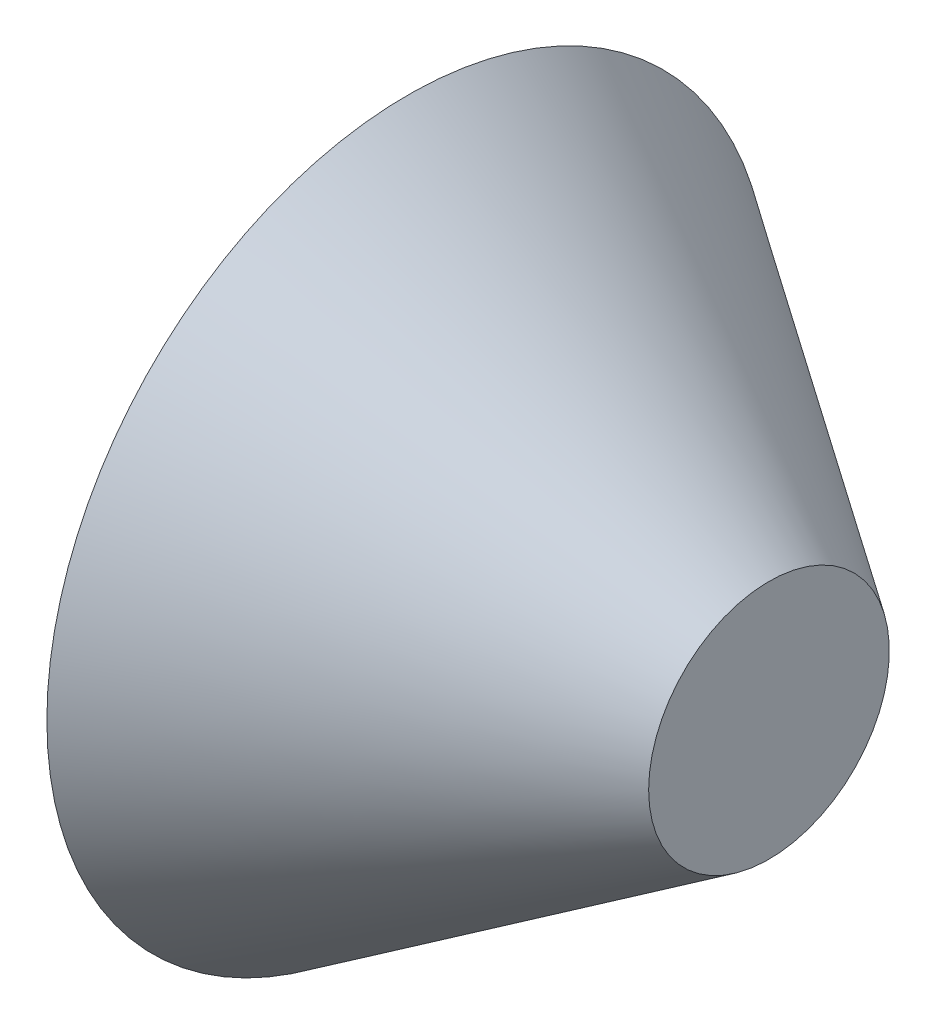
ISO-10303-21;
HEADER;
FILE_DESCRIPTION(('STEP AP214'),'2;1');
FILE_NAME('part.step','',(''),(''),'','','');
FILE_SCHEMA(('AUTOMOTIVE_DESIGN { 1 0 10303 214 1 1 1 1 }'));
ENDSEC;
DATA;
#1=APPLICATION_CONTEXT('core data for automotive mechanical design processes');
#2=APPLICATION_PROTOCOL_DEFINITION('international standard','automotive_design',2000,#1);
#3=PRODUCT_CONTEXT('',#1,'mechanical');
#4=PRODUCT('Part','Part','',(#3));
#5=PRODUCT_RELATED_PRODUCT_CATEGORY('part','',(#4));
#6=PRODUCT_DEFINITION_FORMATION('','',#4);
#7=PRODUCT_DEFINITION_CONTEXT('part definition',#1,'design');
#8=PRODUCT_DEFINITION('design','',#6,#7);
#9=PRODUCT_DEFINITION_SHAPE('','',#8);
#10=(LENGTH_UNIT() NAMED_UNIT(*) SI_UNIT(.MILLI.,.METRE.));
#11=(NAMED_UNIT(*) PLANE_ANGLE_UNIT() SI_UNIT($,.RADIAN.));
#12=(NAMED_UNIT(*) SI_UNIT($,.STERADIAN.) SOLID_ANGLE_UNIT());
#13=UNCERTAINTY_MEASURE_WITH_UNIT(LENGTH_MEASURE(1.E-05),#10,'distance_accuracy_value','');
#14=(GEOMETRIC_REPRESENTATION_CONTEXT(3) GLOBAL_UNCERTAINTY_ASSIGNED_CONTEXT((#13)) GLOBAL_UNIT_ASSIGNED_CONTEXT((#10,
#11,#12)) REPRESENTATION_CONTEXT('',''));
#15=CARTESIAN_POINT('',(0.,0.,0.));
#16=DIRECTION('',(0.,0.,1.));
#17=DIRECTION('',(1.,0.,0.));
#18=AXIS2_PLACEMENT_3D('',#15,#16,#17);
#19=CARTESIAN_POINT('',(-48.2776711868556,0.,0.));
#20=DIRECTION('',(-1.,0.,0.));
#21=DIRECTION('',(0.,0.,1.));
#22=AXIS2_PLACEMENT_3D('',#19,#20,#21);
#23=CONICAL_SURFACE('',#22,30.,0.819867264396956);
#24=CARTESIAN_POINT('',(-20.2776711868555,0.,0.));
#25=VERTEX_POINT('',#24);
#26=VERTEX_LOOP('',#25);
#27=FACE_BOUND('',#26,.T.);
#28=CARTESIAN_POINT('',(-48.2776711868556,0.,0.));
#29=DIRECTION('',(-1.,0.,0.));
#30=DIRECTION('',(0.,0.,1.));
#31=AXIS2_PLACEMENT_3D('',#28,#29,#30);
#32=CIRCLE('',#31,30.);
#33=CARTESIAN_POINT('',(-48.2776711868555,0.,30.));
#34=VERTEX_POINT('',#33);
#35=EDGE_CURVE('E41',#34,#34,#32,.T.);
#36=ORIENTED_EDGE('',*,*,#35,.T.);
#37=EDGE_LOOP('',(#36));
#38=FACE_BOUND('',#37,.T.);
#39=ADVANCED_FACE('F35',(#27,#38),#23,.F.);
#40=CARTESIAN_POINT('',(-18.2776711868555,-10.,0.));
#41=DIRECTION('',(-1.,0.,0.));
#42=DIRECTION('',(0.,0.,1.));
#43=AXIS2_PLACEMENT_3D('',#40,#41,#42);
#44=PLANE('',#43);
#45=CARTESIAN_POINT('',(-18.2776711868555,0.,0.));
#46=DIRECTION('',(-1.,0.,0.));
#47=DIRECTION('',(0.,0.,1.));
#48=AXIS2_PLACEMENT_3D('',#45,#46,#47);
#49=CIRCLE('',#48,10.);
#50=CARTESIAN_POINT('',(-18.2776711868555,0.,10.));
#51=VERTEX_POINT('',#50);
#52=EDGE_CURVE('E11',#51,#51,#49,.T.);
#53=ORIENTED_EDGE('',*,*,#52,.F.);
#54=EDGE_LOOP('',(#53));
#55=FACE_BOUND('',#54,.T.);
#56=ADVANCED_FACE('F46',(#55),#44,.F.);
#57=CARTESIAN_POINT('',(-18.2776711868555,0.,0.));
#58=DIRECTION('',(-1.,0.,0.));
#59=DIRECTION('',(0.,0.,1.));
#60=AXIS2_PLACEMENT_3D('',#57,#58,#59);
#61=CONICAL_SURFACE('',#60,10.,0.588002603547567);
#62=CARTESIAN_POINT('',(-48.2776711868555,0.,30.));
#63=CARTESIAN_POINT('',(-47.9651711868555,0.,29.7916666666667));
#64=CARTESIAN_POINT('',(-47.6526711868555,0.,29.5833333333333));
#65=CARTESIAN_POINT('',(-47.0276711868555,0.,29.1666666666667));
#66=CARTESIAN_POINT('',(-46.7151711868555,0.,28.9583333333333));
#67=CARTESIAN_POINT('',(-46.0901711868555,0.,28.5416666666667));
#68=CARTESIAN_POINT('',(-45.7776711868555,0.,28.3333333333333));
#69=CARTESIAN_POINT('',(-45.1526711868555,0.,27.9166666666667));
#70=CARTESIAN_POINT('',(-44.8401711868555,0.,27.7083333333333));
#71=CARTESIAN_POINT('',(-44.2151711868555,0.,27.2916666666667));
#72=CARTESIAN_POINT('',(-43.9026711868555,0.,27.0833333333333));
#73=CARTESIAN_POINT('',(-43.2776711868555,0.,26.6666666666667));
#74=CARTESIAN_POINT('',(-42.9651711868555,0.,26.4583333333333));
#75=CARTESIAN_POINT('',(-42.3401711868555,0.,26.0416666666667));
#76=CARTESIAN_POINT('',(-42.0276711868555,0.,25.8333333333333));
#77=CARTESIAN_POINT('',(-41.4026711868555,0.,25.4166666666667));
#78=CARTESIAN_POINT('',(-41.0901711868555,0.,25.2083333333333));
#79=CARTESIAN_POINT('',(-40.4651711868555,0.,24.7916666666667));
#80=CARTESIAN_POINT('',(-40.1526711868555,0.,24.5833333333333));
#81=CARTESIAN_POINT('',(-39.5276711868555,0.,24.1666666666667));
#82=CARTESIAN_POINT('',(-39.2151711868555,0.,23.9583333333333));
#83=CARTESIAN_POINT('',(-38.5901711868555,0.,23.5416666666667));
#84=CARTESIAN_POINT('',(-38.2776711868555,0.,23.3333333333333));
#85=CARTESIAN_POINT('',(-37.6526711868555,0.,22.9166666666667));
#86=CARTESIAN_POINT('',(-37.3401711868555,0.,22.7083333333333));
#87=CARTESIAN_POINT('',(-36.7151711868555,0.,22.2916666666667));
#88=CARTESIAN_POINT('',(-36.4026711868555,0.,22.0833333333333));
#89=CARTESIAN_POINT('',(-35.7776711868555,0.,21.6666666666667));
#90=CARTESIAN_POINT('',(-35.4651711868555,0.,21.4583333333333));
#91=CARTESIAN_POINT('',(-34.8401711868555,0.,21.0416666666667));
#92=CARTESIAN_POINT('',(-34.5276711868555,0.,20.8333333333333));
#93=CARTESIAN_POINT('',(-33.9026711868555,0.,20.4166666666667));
#94=CARTESIAN_POINT('',(-33.5901711868555,0.,20.2083333333333));
#95=CARTESIAN_POINT('',(-32.9651711868555,0.,19.7916666666667));
#96=CARTESIAN_POINT('',(-32.6526711868555,0.,19.5833333333333));
#97=CARTESIAN_POINT('',(-32.0276711868555,0.,19.1666666666667));
#98=CARTESIAN_POINT('',(-31.7151711868555,0.,18.9583333333333));
#99=CARTESIAN_POINT('',(-31.0901711868555,0.,18.5416666666667));
#100=CARTESIAN_POINT('',(-30.7776711868555,0.,18.3333333333333));
#101=CARTESIAN_POINT('',(-30.1526711868555,0.,17.9166666666667));
#102=CARTESIAN_POINT('',(-29.8401711868555,0.,17.7083333333333));
#103=CARTESIAN_POINT('',(-29.2151711868555,0.,17.2916666666667));
#104=CARTESIAN_POINT('',(-28.9026711868555,0.,17.0833333333333));
#105=CARTESIAN_POINT('',(-28.2776711868555,0.,16.6666666666667));
#106=CARTESIAN_POINT('',(-27.9651711868555,0.,16.4583333333333));
#107=CARTESIAN_POINT('',(-27.3401711868555,0.,16.0416666666667));
#108=CARTESIAN_POINT('',(-27.0276711868555,0.,15.8333333333333));
#109=CARTESIAN_POINT('',(-26.4026711868555,0.,15.4166666666667));
#110=CARTESIAN_POINT('',(-26.0901711868555,0.,15.2083333333333));
#111=CARTESIAN_POINT('',(-25.4651711868555,0.,14.7916666666667));
#112=CARTESIAN_POINT('',(-25.1526711868555,0.,14.5833333333333));
#113=CARTESIAN_POINT('',(-24.5276711868555,0.,14.1666666666667));
#114=CARTESIAN_POINT('',(-24.2151711868555,0.,13.9583333333333));
#115=CARTESIAN_POINT('',(-23.5901711868555,0.,13.5416666666667));
#116=CARTESIAN_POINT('',(-23.2776711868555,0.,13.3333333333333));
#117=CARTESIAN_POINT('',(-22.6526711868555,0.,12.9166666666667));
#118=CARTESIAN_POINT('',(-22.3401711868555,0.,12.7083333333333));
#119=CARTESIAN_POINT('',(-21.7151711868555,0.,12.2916666666667));
#120=CARTESIAN_POINT('',(-21.4026711868555,0.,12.0833333333333));
#121=CARTESIAN_POINT('',(-20.7776711868555,0.,11.6666666666667));
#122=CARTESIAN_POINT('',(-20.4651711868555,0.,11.4583333333333));
#123=CARTESIAN_POINT('',(-19.8401711868555,0.,11.0416666666667));
#124=CARTESIAN_POINT('',(-19.5276711868555,0.,10.8333333333333));
#125=CARTESIAN_POINT('',(-18.9026711868555,0.,10.4166666666667));
#126=CARTESIAN_POINT('',(-18.5901711868555,0.,10.2083333333333));
#127=CARTESIAN_POINT('',(-18.2776711868555,0.,10.));
#128=B_SPLINE_CURVE_WITH_KNOTS('',3,(#62,#63,#64,#65,#66,#67,#68,#69,#70,#71,#72,#73,#74,#75,
#76,#77,#78,#79,#80,#81,#82,#83,#84,#85,#86,#87,#88,#89,#90,#91,#92,#93,#94,#95,#96,#97,#98,#99,
#100,#101,#102,#103,#104,#105,#106,#107,#108,#109,#110,#111,#112,#113,#114,#115,#116,#117,#118,
#119,#120,#121,#122,#123,#124,#125,#126,#127),.UNSPECIFIED.,.F.,.F.,(4,2,2,2,2,2,2,2,2,2,2,2,2,
2,2,2,2,2,2,2,2,2,2,2,2,2,2,2,2,2,2,2,4),(0.,1.1267347735825,2.253469547165,3.38020432074749,
4.50693909432999,5.63367386791249,6.76040864149498,7.88714341507748,9.01387818865998,
10.1406129622425,11.267347735825,12.3940825094075,13.52081728299,14.6475520565725,
15.774286830155,16.9010216037375,18.0277563773199,19.1544911509025,20.2812259244849,
21.4079606980674,22.5346954716499,23.6614302452324,24.7881650188149,25.9148997923974,
27.0416345659799,28.1683693395624,29.2951041131449,30.4218388867274,31.5485736603099,
32.6753084338924,33.8020432074749,34.9287779810574,36.0555127546399),.UNSPECIFIED.);
#129=EDGE_CURVE('BSEAM50',#34,#51,#128,.T.);
#130=ORIENTED_EDGE('',*,*,#35,.F.);
#131=ORIENTED_EDGE('',*,*,#52,.T.);
#132=ORIENTED_EDGE('',*,*,#129,.T.);
#133=ORIENTED_EDGE('',*,*,#129,.F.);
#134=EDGE_LOOP('',(#130,#132,#131,#133));
#135=FACE_BOUND('',#134,.T.);
#136=ADVANCED_FACE('F50',(#135),#61,.T.);
#137=CLOSED_SHELL('',(#39,#56,#136));
#138=MANIFOLD_SOLID_BREP('B2',#137);
#139=ADVANCED_BREP_SHAPE_REPRESENTATION('',(#18,#138),#14);
#140=SHAPE_DEFINITION_REPRESENTATION(#9,#139);
ENDSEC;
END-ISO-10303-21;
